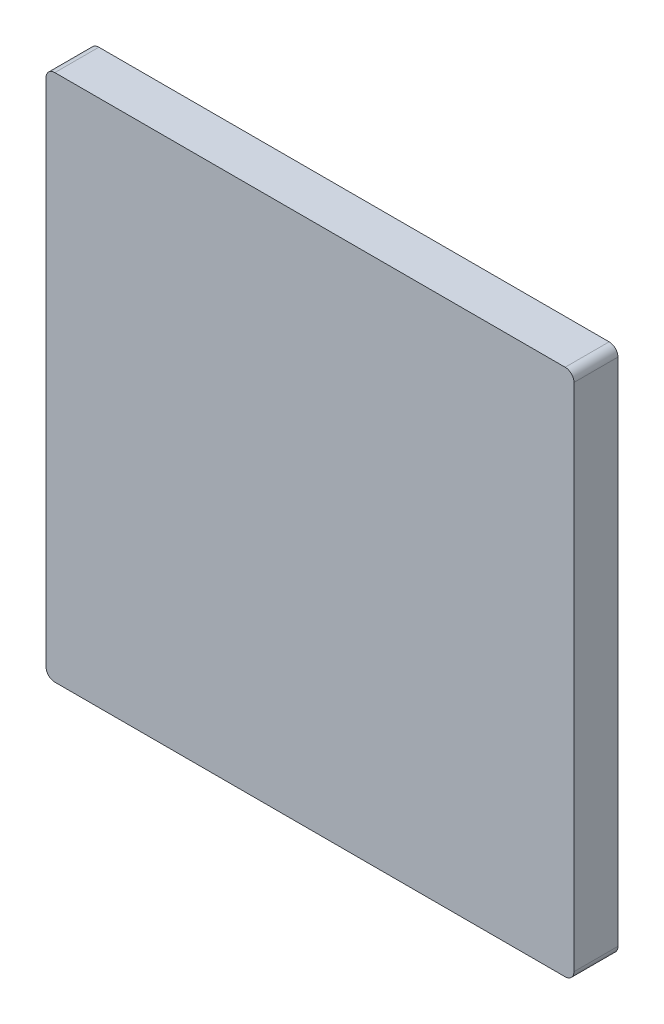
ISO-10303-21;
HEADER;
FILE_DESCRIPTION(('STEP AP214'),'2;1');
FILE_NAME('part.step','',(''),(''),'','','');
FILE_SCHEMA(('AUTOMOTIVE_DESIGN { 1 0 10303 214 1 1 1 1 }'));
ENDSEC;
DATA;
#1=APPLICATION_CONTEXT('core data for automotive mechanical design processes');
#2=APPLICATION_PROTOCOL_DEFINITION('international standard','automotive_design',2000,#1);
#3=PRODUCT_CONTEXT('',#1,'mechanical');
#4=PRODUCT('Part','Part','',(#3));
#5=PRODUCT_RELATED_PRODUCT_CATEGORY('part','',(#4));
#6=PRODUCT_DEFINITION_FORMATION('','',#4);
#7=PRODUCT_DEFINITION_CONTEXT('part definition',#1,'design');
#8=PRODUCT_DEFINITION('design','',#6,#7);
#9=PRODUCT_DEFINITION_SHAPE('','',#8);
#10=(LENGTH_UNIT() NAMED_UNIT(*) SI_UNIT(.MILLI.,.METRE.));
#11=(NAMED_UNIT(*) PLANE_ANGLE_UNIT() SI_UNIT($,.RADIAN.));
#12=(NAMED_UNIT(*) SI_UNIT($,.STERADIAN.) SOLID_ANGLE_UNIT());
#13=UNCERTAINTY_MEASURE_WITH_UNIT(LENGTH_MEASURE(1.E-05),#10,'distance_accuracy_value','');
#14=(GEOMETRIC_REPRESENTATION_CONTEXT(3) GLOBAL_UNCERTAINTY_ASSIGNED_CONTEXT((#13)) GLOBAL_UNIT_ASSIGNED_CONTEXT((#10,
#11,#12)) REPRESENTATION_CONTEXT('',''));
#15=CARTESIAN_POINT('',(0.,0.,0.));
#16=DIRECTION('',(0.,0.,1.));
#17=DIRECTION('',(1.,0.,0.));
#18=AXIS2_PLACEMENT_3D('',#15,#16,#17);
#19=CARTESIAN_POINT('',(-4.89632107023411,5.34782608695652,0.5));
#20=DIRECTION('',(1.,0.,0.));
#21=DIRECTION('',(0.,0.,-1.));
#22=AXIS2_PLACEMENT_3D('',#19,#20,#21);
#23=PLANE('',#22);
#24=DIRECTION('',(0.,-1.,0.));
#25=VECTOR('',#24,1.);
#26=CARTESIAN_POINT('',(-4.89632107023411,5.34782608695652,0.5));
#27=LINE('',#26,#25);
#28=CARTESIAN_POINT('',(-4.89632107023411,5.24782608695652,0.5));
#29=VERTEX_POINT('',#28);
#30=CARTESIAN_POINT('',(-4.89632107023411,-0.552173913043478,0.5));
#31=VERTEX_POINT('',#30);
#32=EDGE_CURVE('E119',#29,#31,#27,.T.);
#33=ORIENTED_EDGE('',*,*,#32,.F.);
#34=DIRECTION('',(0.,0.,-1.));
#35=VECTOR('',#34,1.);
#36=CARTESIAN_POINT('',(-4.89632107023411,5.24782608695652,0.5));
#37=LINE('',#36,#35);
#38=CARTESIAN_POINT('',(-4.89632107023411,5.24782608695652,0.));
#39=VERTEX_POINT('',#38);
#40=EDGE_CURVE('E104',#29,#39,#37,.T.);
#41=ORIENTED_EDGE('',*,*,#40,.T.);
#42=DIRECTION('',(0.,-1.,0.));
#43=VECTOR('',#42,1.);
#44=CARTESIAN_POINT('',(-4.89632107023411,5.34782608695652,0.));
#45=LINE('',#44,#43);
#46=CARTESIAN_POINT('',(-4.89632107023411,-0.552173913043478,0.));
#47=VERTEX_POINT('',#46);
#48=EDGE_CURVE('E116',#39,#47,#45,.T.);
#49=ORIENTED_EDGE('',*,*,#48,.T.);
#50=DIRECTION('',(0.,0.,-1.));
#51=VECTOR('',#50,1.);
#52=CARTESIAN_POINT('',(-4.89632107023411,-0.552173913043478,0.5));
#53=LINE('',#52,#51);
#54=EDGE_CURVE('E121',#47,#31,#53,.F.);
#55=ORIENTED_EDGE('',*,*,#54,.T.);
#56=EDGE_LOOP('',(#33,#41,#49,#55));
#57=FACE_BOUND('',#56,.T.);
#58=ADVANCED_FACE('F34',(#57),#23,.F.);
#59=CARTESIAN_POINT('',(-4.89632107023411,-0.652173913043478,0.5));
#60=DIRECTION('',(0.,1.,0.));
#61=DIRECTION('',(0.,0.,1.));
#62=AXIS2_PLACEMENT_3D('',#59,#60,#61);
#63=PLANE('',#62);
#64=DIRECTION('',(1.,0.,0.));
#65=VECTOR('',#64,1.);
#66=CARTESIAN_POINT('',(-4.89632107023411,-0.652173913043478,0.));
#67=LINE('',#66,#65);
#68=CARTESIAN_POINT('',(-4.79632107023411,-0.652173913043478,0.));
#69=VERTEX_POINT('',#68);
#70=CARTESIAN_POINT('',(1.00367892976589,-0.652173913043478,0.));
#71=VERTEX_POINT('',#70);
#72=EDGE_CURVE('E125',#69,#71,#67,.T.);
#73=ORIENTED_EDGE('',*,*,#72,.T.);
#74=DIRECTION('',(0.,0.,-1.));
#75=VECTOR('',#74,1.);
#76=CARTESIAN_POINT('',(1.00367892976589,-0.652173913043478,0.5));
#77=LINE('',#76,#75);
#78=CARTESIAN_POINT('',(1.00367892976589,-0.652173913043478,0.5));
#79=VERTEX_POINT('',#78);
#80=EDGE_CURVE('E11',#71,#79,#77,.F.);
#81=ORIENTED_EDGE('',*,*,#80,.T.);
#82=DIRECTION('',(1.,0.,0.));
#83=VECTOR('',#82,1.);
#84=CARTESIAN_POINT('',(-4.89632107023411,-0.652173913043478,0.5));
#85=LINE('',#84,#83);
#86=CARTESIAN_POINT('',(-4.79632107023411,-0.652173913043478,0.5));
#87=VERTEX_POINT('',#86);
#88=EDGE_CURVE('E161',#87,#79,#85,.T.);
#89=ORIENTED_EDGE('',*,*,#88,.F.);
#90=DIRECTION('',(0.,0.,-1.));
#91=VECTOR('',#90,1.);
#92=CARTESIAN_POINT('',(-4.79632107023411,-0.652173913043478,0.5));
#93=LINE('',#92,#91);
#94=EDGE_CURVE('E42',#87,#69,#93,.T.);
#95=ORIENTED_EDGE('',*,*,#94,.T.);
#96=EDGE_LOOP('',(#73,#81,#89,#95));
#97=FACE_BOUND('',#96,.T.);
#98=ADVANCED_FACE('F159',(#97),#63,.F.);
#99=CARTESIAN_POINT('',(1.10367892976589,5.34782608695652,0.5));
#100=DIRECTION('',(-1.,0.,0.));
#101=DIRECTION('',(0.,-1.,0.));
#102=AXIS2_PLACEMENT_3D('',#99,#100,#101);
#103=PLANE('',#102);
#104=DIRECTION('',(0.,1.,0.));
#105=VECTOR('',#104,1.);
#106=CARTESIAN_POINT('',(1.10367892976589,5.34782608695652,0.));
#107=LINE('',#106,#105);
#108=CARTESIAN_POINT('',(1.10367892976589,-0.552173913043478,0.));
#109=VERTEX_POINT('',#108);
#110=CARTESIAN_POINT('',(1.10367892976589,5.24782608695652,0.));
#111=VERTEX_POINT('',#110);
#112=EDGE_CURVE('E128',#109,#111,#107,.T.);
#113=ORIENTED_EDGE('',*,*,#112,.T.);
#114=DIRECTION('',(0.,0.,-1.));
#115=VECTOR('',#114,1.);
#116=CARTESIAN_POINT('',(1.10367892976589,5.24782608695652,0.5));
#117=LINE('',#116,#115);
#118=CARTESIAN_POINT('',(1.10367892976589,5.24782608695652,0.5));
#119=VERTEX_POINT('',#118);
#120=EDGE_CURVE('E49',#111,#119,#117,.F.);
#121=ORIENTED_EDGE('',*,*,#120,.T.);
#122=DIRECTION('',(0.,1.,0.));
#123=VECTOR('',#122,1.);
#124=CARTESIAN_POINT('',(1.10367892976589,5.34782608695652,0.5));
#125=LINE('',#124,#123);
#126=CARTESIAN_POINT('',(1.10367892976589,-0.552173913043478,0.5));
#127=VERTEX_POINT('',#126);
#128=EDGE_CURVE('E169',#127,#119,#125,.T.);
#129=ORIENTED_EDGE('',*,*,#128,.F.);
#130=DIRECTION('',(0.,0.,-1.));
#131=VECTOR('',#130,1.);
#132=CARTESIAN_POINT('',(1.10367892976589,-0.552173913043478,0.5));
#133=LINE('',#132,#131);
#134=EDGE_CURVE('E152',#127,#109,#133,.T.);
#135=ORIENTED_EDGE('',*,*,#134,.T.);
#136=EDGE_LOOP('',(#113,#121,#129,#135));
#137=FACE_BOUND('',#136,.T.);
#138=ADVANCED_FACE('F168',(#137),#103,.F.);
#139=CARTESIAN_POINT('',(-4.89632107023411,5.34782608695652,0.5));
#140=DIRECTION('',(0.,-1.,0.));
#141=DIRECTION('',(0.,0.,-1.));
#142=AXIS2_PLACEMENT_3D('',#139,#140,#141);
#143=PLANE('',#142);
#144=DIRECTION('',(-1.,0.,0.));
#145=VECTOR('',#144,1.);
#146=CARTESIAN_POINT('',(-4.89632107023411,5.34782608695652,0.));
#147=LINE('',#146,#145);
#148=CARTESIAN_POINT('',(1.00367892976589,5.34782608695652,0.));
#149=VERTEX_POINT('',#148);
#150=CARTESIAN_POINT('',(-4.79632107023411,5.34782608695652,0.));
#151=VERTEX_POINT('',#150);
#152=EDGE_CURVE('E135',#149,#151,#147,.T.);
#153=ORIENTED_EDGE('',*,*,#152,.T.);
#154=DIRECTION('',(0.,0.,-1.));
#155=VECTOR('',#154,1.);
#156=CARTESIAN_POINT('',(-4.79632107023411,5.34782608695652,0.5));
#157=LINE('',#156,#155);
#158=CARTESIAN_POINT('',(-4.79632107023411,5.34782608695652,0.5));
#159=VERTEX_POINT('',#158);
#160=EDGE_CURVE('E105',#151,#159,#157,.F.);
#161=ORIENTED_EDGE('',*,*,#160,.T.);
#162=DIRECTION('',(-1.,0.,0.));
#163=VECTOR('',#162,1.);
#164=CARTESIAN_POINT('',(-4.89632107023411,5.34782608695652,0.5));
#165=LINE('',#164,#163);
#166=CARTESIAN_POINT('',(1.00367892976589,5.34782608695652,0.5));
#167=VERTEX_POINT('',#166);
#168=EDGE_CURVE('E131',#167,#159,#165,.T.);
#169=ORIENTED_EDGE('',*,*,#168,.F.);
#170=DIRECTION('',(0.,0.,-1.));
#171=VECTOR('',#170,1.);
#172=CARTESIAN_POINT('',(1.00367892976589,5.34782608695652,0.5));
#173=LINE('',#172,#171);
#174=EDGE_CURVE('E110',#167,#149,#173,.T.);
#175=ORIENTED_EDGE('',*,*,#174,.T.);
#176=EDGE_LOOP('',(#153,#161,#169,#175));
#177=FACE_BOUND('',#176,.T.);
#178=ADVANCED_FACE('F197',(#177),#143,.F.);
#179=CARTESIAN_POINT('',(0.,0.,0.5));
#180=DIRECTION('',(0.,0.,1.));
#181=DIRECTION('',(1.,0.,0.));
#182=AXIS2_PLACEMENT_3D('',#179,#180,#181);
#183=PLANE('',#182);
#184=ORIENTED_EDGE('',*,*,#168,.T.);
#185=CARTESIAN_POINT('',(-4.79632107023411,5.24782608695652,0.5));
#186=DIRECTION('',(0.,0.,1.));
#187=DIRECTION('',(1.,0.,0.));
#188=AXIS2_PLACEMENT_3D('',#185,#186,#187);
#189=CIRCLE('',#188,0.1);
#190=EDGE_CURVE('E150',#159,#29,#189,.T.);
#191=ORIENTED_EDGE('',*,*,#190,.T.);
#192=ORIENTED_EDGE('',*,*,#32,.T.);
#193=CARTESIAN_POINT('',(-4.79632107023411,-0.552173913043478,0.5));
#194=DIRECTION('',(0.,0.,1.));
#195=DIRECTION('',(1.,0.,0.));
#196=AXIS2_PLACEMENT_3D('',#193,#194,#195);
#197=CIRCLE('',#196,0.1);
#198=EDGE_CURVE('E145',#31,#87,#197,.T.);
#199=ORIENTED_EDGE('',*,*,#198,.T.);
#200=ORIENTED_EDGE('',*,*,#88,.T.);
#201=CARTESIAN_POINT('',(1.00367892976589,-0.552173913043478,0.5));
#202=DIRECTION('',(0.,0.,1.));
#203=DIRECTION('',(1.,0.,0.));
#204=AXIS2_PLACEMENT_3D('',#201,#202,#203);
#205=CIRCLE('',#204,0.1);
#206=EDGE_CURVE('E56',#79,#127,#205,.T.);
#207=ORIENTED_EDGE('',*,*,#206,.T.);
#208=ORIENTED_EDGE('',*,*,#128,.T.);
#209=CARTESIAN_POINT('',(1.00367892976589,5.24782608695652,0.5));
#210=DIRECTION('',(0.,0.,1.));
#211=DIRECTION('',(1.,0.,0.));
#212=AXIS2_PLACEMENT_3D('',#209,#210,#211);
#213=CIRCLE('',#212,0.1);
#214=EDGE_CURVE('E148',#119,#167,#213,.T.);
#215=ORIENTED_EDGE('',*,*,#214,.T.);
#216=EDGE_LOOP('',(#184,#191,#192,#199,#200,#207,#208,#215));
#217=FACE_BOUND('',#216,.T.);
#218=ADVANCED_FACE('F174',(#217),#183,.T.);
#219=CARTESIAN_POINT('',(0.,0.,0.));
#220=DIRECTION('',(0.,0.,1.));
#221=DIRECTION('',(1.,0.,0.));
#222=AXIS2_PLACEMENT_3D('',#219,#220,#221);
#223=PLANE('',#222);
#224=ORIENTED_EDGE('',*,*,#48,.F.);
#225=CARTESIAN_POINT('',(-4.79632107023411,5.24782608695652,0.));
#226=DIRECTION('',(0.,0.,1.));
#227=DIRECTION('',(1.,0.,0.));
#228=AXIS2_PLACEMENT_3D('',#225,#226,#227);
#229=CIRCLE('',#228,0.1);
#230=EDGE_CURVE('E100',#39,#151,#229,.F.);
#231=ORIENTED_EDGE('',*,*,#230,.T.);
#232=ORIENTED_EDGE('',*,*,#152,.F.);
#233=CARTESIAN_POINT('',(1.00367892976589,5.24782608695652,0.));
#234=DIRECTION('',(0.,0.,1.));
#235=DIRECTION('',(1.,0.,0.));
#236=AXIS2_PLACEMENT_3D('',#233,#234,#235);
#237=CIRCLE('',#236,0.1);
#238=EDGE_CURVE('E111',#149,#111,#237,.F.);
#239=ORIENTED_EDGE('',*,*,#238,.T.);
#240=ORIENTED_EDGE('',*,*,#112,.F.);
#241=CARTESIAN_POINT('',(1.00367892976589,-0.552173913043478,0.));
#242=DIRECTION('',(0.,0.,1.));
#243=DIRECTION('',(1.,0.,0.));
#244=AXIS2_PLACEMENT_3D('',#241,#242,#243);
#245=CIRCLE('',#244,0.1);
#246=EDGE_CURVE('E139',#109,#71,#245,.F.);
#247=ORIENTED_EDGE('',*,*,#246,.T.);
#248=ORIENTED_EDGE('',*,*,#72,.F.);
#249=CARTESIAN_POINT('',(-4.79632107023411,-0.552173913043478,0.));
#250=DIRECTION('',(0.,0.,1.));
#251=DIRECTION('',(1.,0.,0.));
#252=AXIS2_PLACEMENT_3D('',#249,#250,#251);
#253=CIRCLE('',#252,0.1);
#254=EDGE_CURVE('E120',#69,#47,#253,.F.);
#255=ORIENTED_EDGE('',*,*,#254,.T.);
#256=EDGE_LOOP('',(#224,#231,#232,#239,#240,#247,#248,#255));
#257=FACE_BOUND('',#256,.T.);
#258=ADVANCED_FACE('F123',(#257),#223,.F.);
#259=CARTESIAN_POINT('',(-4.79632107023411,5.24782608695652,0.5));
#260=DIRECTION('',(0.,0.,-1.));
#261=DIRECTION('',(-1.,0.,0.));
#262=AXIS2_PLACEMENT_3D('',#259,#260,#261);
#263=CYLINDRICAL_SURFACE('',#262,0.1);
#264=ORIENTED_EDGE('',*,*,#190,.F.);
#265=ORIENTED_EDGE('',*,*,#160,.F.);
#266=ORIENTED_EDGE('',*,*,#230,.F.);
#267=ORIENTED_EDGE('',*,*,#40,.F.);
#268=EDGE_LOOP('',(#264,#265,#266,#267));
#269=FACE_BOUND('',#268,.T.);
#270=ADVANCED_FACE('F103',(#269),#263,.T.);
#271=CARTESIAN_POINT('',(1.00367892976589,5.24782608695652,0.5));
#272=DIRECTION('',(0.,0.,-1.));
#273=DIRECTION('',(-1.,0.,0.));
#274=AXIS2_PLACEMENT_3D('',#271,#272,#273);
#275=CYLINDRICAL_SURFACE('',#274,0.1);
#276=ORIENTED_EDGE('',*,*,#214,.F.);
#277=ORIENTED_EDGE('',*,*,#120,.F.);
#278=ORIENTED_EDGE('',*,*,#238,.F.);
#279=ORIENTED_EDGE('',*,*,#174,.F.);
#280=EDGE_LOOP('',(#276,#277,#278,#279));
#281=FACE_BOUND('',#280,.T.);
#282=ADVANCED_FACE('F179',(#281),#275,.T.);
#283=CARTESIAN_POINT('',(1.00367892976589,-0.552173913043478,0.5));
#284=DIRECTION('',(0.,0.,-1.));
#285=DIRECTION('',(-1.,0.,0.));
#286=AXIS2_PLACEMENT_3D('',#283,#284,#285);
#287=CYLINDRICAL_SURFACE('',#286,0.1);
#288=ORIENTED_EDGE('',*,*,#206,.F.);
#289=ORIENTED_EDGE('',*,*,#80,.F.);
#290=ORIENTED_EDGE('',*,*,#246,.F.);
#291=ORIENTED_EDGE('',*,*,#134,.F.);
#292=EDGE_LOOP('',(#288,#289,#290,#291));
#293=FACE_BOUND('',#292,.T.);
#294=ADVANCED_FACE('F167',(#293),#287,.T.);
#295=CARTESIAN_POINT('',(-4.79632107023411,-0.552173913043478,0.5));
#296=DIRECTION('',(0.,0.,-1.));
#297=DIRECTION('',(-1.,0.,0.));
#298=AXIS2_PLACEMENT_3D('',#295,#296,#297);
#299=CYLINDRICAL_SURFACE('',#298,0.1);
#300=ORIENTED_EDGE('',*,*,#198,.F.);
#301=ORIENTED_EDGE('',*,*,#54,.F.);
#302=ORIENTED_EDGE('',*,*,#254,.F.);
#303=ORIENTED_EDGE('',*,*,#94,.F.);
#304=EDGE_LOOP('',(#300,#301,#302,#303));
#305=FACE_BOUND('',#304,.T.);
#306=ADVANCED_FACE('F36',(#305),#299,.T.);
#307=CLOSED_SHELL('',(#58,#98,#138,#178,#218,#258,#270,#282,#294,#306));
#308=MANIFOLD_SOLID_BREP('B2',#307);
#309=ADVANCED_BREP_SHAPE_REPRESENTATION('',(#18,#308),#14);
#310=SHAPE_DEFINITION_REPRESENTATION(#9,#309);
ENDSEC;
END-ISO-10303-21;
